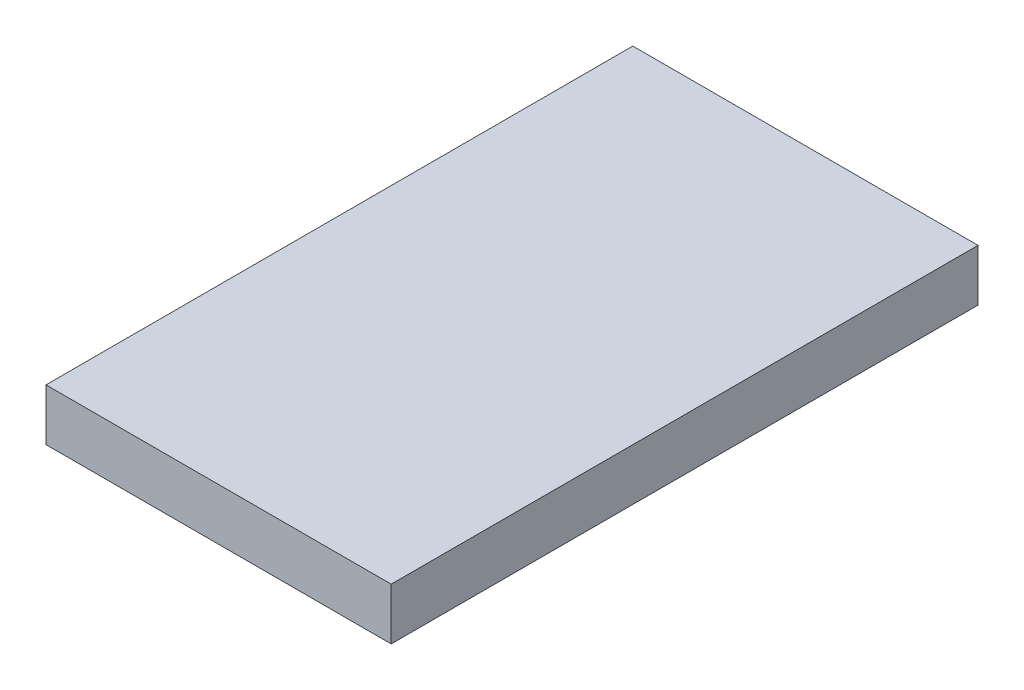
ISO-10303-21;
HEADER;
FILE_DESCRIPTION(('STEP AP214'),'2;1');
FILE_NAME('part.step','',(''),(''),'','','');
FILE_SCHEMA(('AUTOMOTIVE_DESIGN { 1 0 10303 214 1 1 1 1 }'));
ENDSEC;
DATA;
#1=APPLICATION_CONTEXT('core data for automotive mechanical design processes');
#2=APPLICATION_PROTOCOL_DEFINITION('international standard','automotive_design',2000,#1);
#3=PRODUCT_CONTEXT('',#1,'mechanical');
#4=PRODUCT('Part','Part','',(#3));
#5=PRODUCT_RELATED_PRODUCT_CATEGORY('part','',(#4));
#6=PRODUCT_DEFINITION_FORMATION('','',#4);
#7=PRODUCT_DEFINITION_CONTEXT('part definition',#1,'design');
#8=PRODUCT_DEFINITION('design','',#6,#7);
#9=PRODUCT_DEFINITION_SHAPE('','',#8);
#10=(LENGTH_UNIT() NAMED_UNIT(*) SI_UNIT(.MILLI.,.METRE.));
#11=(NAMED_UNIT(*) PLANE_ANGLE_UNIT() SI_UNIT($,.RADIAN.));
#12=(NAMED_UNIT(*) SI_UNIT($,.STERADIAN.) SOLID_ANGLE_UNIT());
#13=UNCERTAINTY_MEASURE_WITH_UNIT(LENGTH_MEASURE(1.E-05),#10,'distance_accuracy_value','');
#14=(GEOMETRIC_REPRESENTATION_CONTEXT(3) GLOBAL_UNCERTAINTY_ASSIGNED_CONTEXT((#13)) GLOBAL_UNIT_ASSIGNED_CONTEXT((#10,
#11,#12)) REPRESENTATION_CONTEXT('',''));
#15=CARTESIAN_POINT('',(0.,0.,0.));
#16=DIRECTION('',(0.,0.,1.));
#17=DIRECTION('',(1.,0.,0.));
#18=AXIS2_PLACEMENT_3D('',#15,#16,#17);
#19=CARTESIAN_POINT('',(10.,3.,-17.));
#20=DIRECTION('',(-1.,0.,0.));
#21=DIRECTION('',(0.,0.,1.));
#22=AXIS2_PLACEMENT_3D('',#19,#20,#21);
#23=PLANE('',#22);
#24=DIRECTION('',(0.,0.,-1.));
#25=VECTOR('',#24,1.);
#26=CARTESIAN_POINT('',(10.,0.,-17.));
#27=LINE('',#26,#25);
#28=CARTESIAN_POINT('',(10.,0.,17.));
#29=VERTEX_POINT('',#28);
#30=CARTESIAN_POINT('',(10.,0.,-17.));
#31=VERTEX_POINT('',#30);
#32=EDGE_CURVE('E96',#29,#31,#27,.T.);
#33=ORIENTED_EDGE('',*,*,#32,.T.);
#34=DIRECTION('',(0.,-1.,0.));
#35=VECTOR('',#34,1.);
#36=CARTESIAN_POINT('',(10.,3.,-17.));
#37=LINE('',#36,#35);
#38=CARTESIAN_POINT('',(10.,3.,-17.));
#39=VERTEX_POINT('',#38);
#40=EDGE_CURVE('E11',#39,#31,#37,.T.);
#41=ORIENTED_EDGE('',*,*,#40,.F.);
#42=DIRECTION('',(0.,0.,-1.));
#43=VECTOR('',#42,1.);
#44=CARTESIAN_POINT('',(10.,3.,-17.));
#45=LINE('',#44,#43);
#46=CARTESIAN_POINT('',(10.,3.,17.));
#47=VERTEX_POINT('',#46);
#48=EDGE_CURVE('E84',#47,#39,#45,.T.);
#49=ORIENTED_EDGE('',*,*,#48,.F.);
#50=DIRECTION('',(0.,-1.,0.));
#51=VECTOR('',#50,1.);
#52=CARTESIAN_POINT('',(10.,3.,17.));
#53=LINE('',#52,#51);
#54=EDGE_CURVE('E92',#47,#29,#53,.T.);
#55=ORIENTED_EDGE('',*,*,#54,.T.);
#56=EDGE_LOOP('',(#33,#41,#49,#55));
#57=FACE_BOUND('',#56,.T.);
#58=ADVANCED_FACE('F33',(#57),#23,.F.);
#59=CARTESIAN_POINT('',(-9.99999999999999,3.,-17.));
#60=DIRECTION('',(0.,0.,1.));
#61=DIRECTION('',(1.,0.,0.));
#62=AXIS2_PLACEMENT_3D('',#59,#60,#61);
#63=PLANE('',#62);
#64=DIRECTION('',(-1.,0.,0.));
#65=VECTOR('',#64,1.);
#66=CARTESIAN_POINT('',(-9.99999999999999,0.,-17.));
#67=LINE('',#66,#65);
#68=CARTESIAN_POINT('',(-9.99999999999999,0.,-17.));
#69=VERTEX_POINT('',#68);
#70=EDGE_CURVE('E88',#31,#69,#67,.T.);
#71=ORIENTED_EDGE('',*,*,#70,.T.);
#72=DIRECTION('',(0.,-1.,0.));
#73=VECTOR('',#72,1.);
#74=CARTESIAN_POINT('',(-9.99999999999999,3.,-17.));
#75=LINE('',#74,#73);
#76=CARTESIAN_POINT('',(-9.99999999999999,3.,-17.));
#77=VERTEX_POINT('',#76);
#78=EDGE_CURVE('E41',#77,#69,#75,.T.);
#79=ORIENTED_EDGE('',*,*,#78,.F.);
#80=DIRECTION('',(-1.,0.,0.));
#81=VECTOR('',#80,1.);
#82=CARTESIAN_POINT('',(-9.99999999999999,3.,-17.));
#83=LINE('',#82,#81);
#84=EDGE_CURVE('E79',#39,#77,#83,.T.);
#85=ORIENTED_EDGE('',*,*,#84,.F.);
#86=ORIENTED_EDGE('',*,*,#40,.T.);
#87=EDGE_LOOP('',(#71,#79,#85,#86));
#88=FACE_BOUND('',#87,.T.);
#89=ADVANCED_FACE('F87',(#88),#63,.F.);
#90=CARTESIAN_POINT('',(-9.99999999999999,3.,-17.));
#91=DIRECTION('',(1.,0.,0.));
#92=DIRECTION('',(0.,0.,-1.));
#93=AXIS2_PLACEMENT_3D('',#90,#91,#92);
#94=PLANE('',#93);
#95=DIRECTION('',(0.,0.,1.));
#96=VECTOR('',#95,1.);
#97=CARTESIAN_POINT('',(-9.99999999999999,0.,-17.));
#98=LINE('',#97,#96);
#99=CARTESIAN_POINT('',(-9.99999999999999,0.,17.));
#100=VERTEX_POINT('',#99);
#101=EDGE_CURVE('E66',#69,#100,#98,.T.);
#102=ORIENTED_EDGE('',*,*,#101,.T.);
#103=DIRECTION('',(0.,-1.,0.));
#104=VECTOR('',#103,1.);
#105=CARTESIAN_POINT('',(-9.99999999999999,3.,17.));
#106=LINE('',#105,#104);
#107=CARTESIAN_POINT('',(-9.99999999999999,3.,17.));
#108=VERTEX_POINT('',#107);
#109=EDGE_CURVE('E89',#108,#100,#106,.T.);
#110=ORIENTED_EDGE('',*,*,#109,.F.);
#111=DIRECTION('',(0.,0.,1.));
#112=VECTOR('',#111,1.);
#113=CARTESIAN_POINT('',(-9.99999999999999,3.,-17.));
#114=LINE('',#113,#112);
#115=EDGE_CURVE('E82',#77,#108,#114,.T.);
#116=ORIENTED_EDGE('',*,*,#115,.F.);
#117=ORIENTED_EDGE('',*,*,#78,.T.);
#118=EDGE_LOOP('',(#102,#110,#116,#117));
#119=FACE_BOUND('',#118,.T.);
#120=ADVANCED_FACE('F90',(#119),#94,.F.);
#121=CARTESIAN_POINT('',(-9.99999999999999,3.,17.));
#122=DIRECTION('',(0.,0.,-1.));
#123=DIRECTION('',(-1.,0.,0.));
#124=AXIS2_PLACEMENT_3D('',#121,#122,#123);
#125=PLANE('',#124);
#126=DIRECTION('',(1.,0.,0.));
#127=VECTOR('',#126,1.);
#128=CARTESIAN_POINT('',(-9.99999999999999,0.,17.));
#129=LINE('',#128,#127);
#130=EDGE_CURVE('E72',#100,#29,#129,.T.);
#131=ORIENTED_EDGE('',*,*,#130,.T.);
#132=ORIENTED_EDGE('',*,*,#54,.F.);
#133=DIRECTION('',(1.,0.,0.));
#134=VECTOR('',#133,1.);
#135=CARTESIAN_POINT('',(-9.99999999999999,3.,17.));
#136=LINE('',#135,#134);
#137=EDGE_CURVE('E49',#108,#47,#136,.T.);
#138=ORIENTED_EDGE('',*,*,#137,.F.);
#139=ORIENTED_EDGE('',*,*,#109,.T.);
#140=EDGE_LOOP('',(#131,#132,#138,#139));
#141=FACE_BOUND('',#140,.T.);
#142=ADVANCED_FACE('F103',(#141),#125,.F.);
#143=CARTESIAN_POINT('',(0.,3.,0.));
#144=DIRECTION('',(0.,1.,0.));
#145=DIRECTION('',(0.,0.,1.));
#146=AXIS2_PLACEMENT_3D('',#143,#144,#145);
#147=PLANE('',#146);
#148=ORIENTED_EDGE('',*,*,#48,.T.);
#149=ORIENTED_EDGE('',*,*,#84,.T.);
#150=ORIENTED_EDGE('',*,*,#115,.T.);
#151=ORIENTED_EDGE('',*,*,#137,.T.);
#152=EDGE_LOOP('',(#148,#149,#150,#151));
#153=FACE_BOUND('',#152,.T.);
#154=ADVANCED_FACE('F80',(#153),#147,.T.);
#155=CARTESIAN_POINT('',(0.,0.,0.));
#156=DIRECTION('',(0.,1.,0.));
#157=DIRECTION('',(0.,0.,1.));
#158=AXIS2_PLACEMENT_3D('',#155,#156,#157);
#159=PLANE('',#158);
#160=ORIENTED_EDGE('',*,*,#32,.F.);
#161=ORIENTED_EDGE('',*,*,#130,.F.);
#162=ORIENTED_EDGE('',*,*,#101,.F.);
#163=ORIENTED_EDGE('',*,*,#70,.F.);
#164=EDGE_LOOP('',(#160,#161,#162,#163));
#165=FACE_BOUND('',#164,.T.);
#166=ADVANCED_FACE('F106',(#165),#159,.F.);
#167=CLOSED_SHELL('',(#58,#89,#120,#142,#154,#166));
#168=MANIFOLD_SOLID_BREP('B2',#167);
#169=ADVANCED_BREP_SHAPE_REPRESENTATION('',(#18,#168),#14);
#170=SHAPE_DEFINITION_REPRESENTATION(#9,#169);
ENDSEC;
END-ISO-10303-21;
